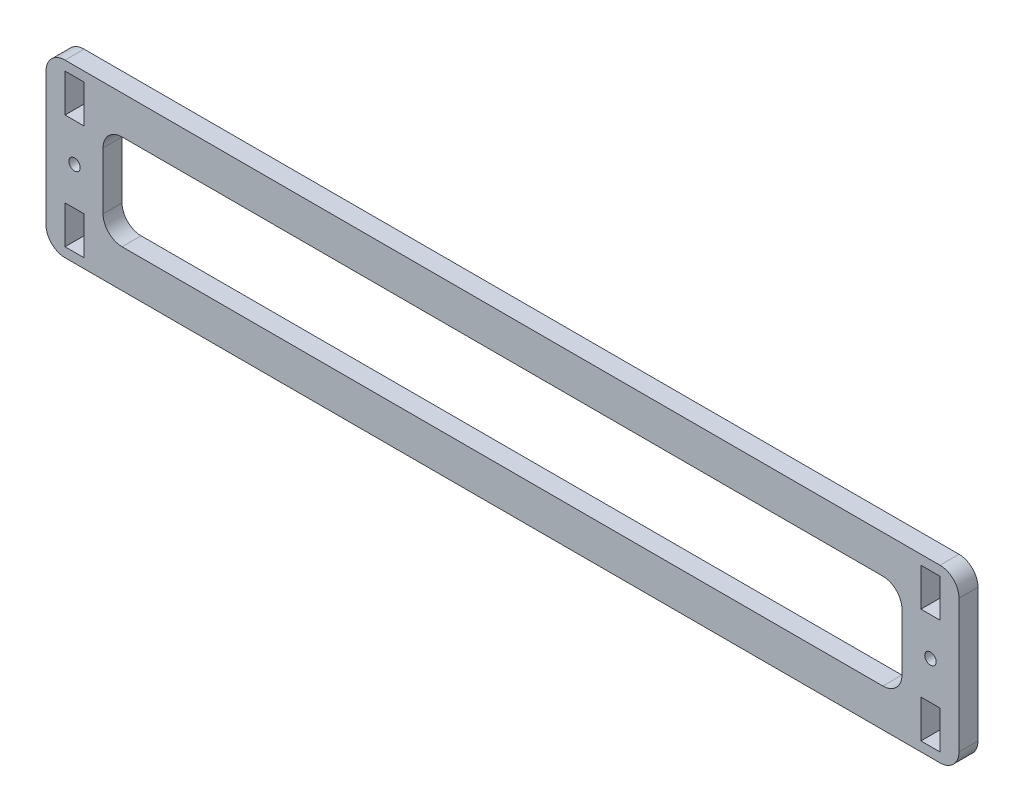
ISO-10303-21;
HEADER;
FILE_DESCRIPTION(('STEP AP214'),'2;1');
FILE_NAME('part.step','',(''),(''),'','','');
FILE_SCHEMA(('AUTOMOTIVE_DESIGN { 1 0 10303 214 1 1 1 1 }'));
ENDSEC;
DATA;
#1=APPLICATION_CONTEXT('core data for automotive mechanical design processes');
#2=APPLICATION_PROTOCOL_DEFINITION('international standard','automotive_design',2000,#1);
#3=PRODUCT_CONTEXT('',#1,'mechanical');
#4=PRODUCT('Part','Part','',(#3));
#5=PRODUCT_RELATED_PRODUCT_CATEGORY('part','',(#4));
#6=PRODUCT_DEFINITION_FORMATION('','',#4);
#7=PRODUCT_DEFINITION_CONTEXT('part definition',#1,'design');
#8=PRODUCT_DEFINITION('design','',#6,#7);
#9=PRODUCT_DEFINITION_SHAPE('','',#8);
#10=(LENGTH_UNIT() NAMED_UNIT(*) SI_UNIT(.MILLI.,.METRE.));
#11=(NAMED_UNIT(*) PLANE_ANGLE_UNIT() SI_UNIT($,.RADIAN.));
#12=(NAMED_UNIT(*) SI_UNIT($,.STERADIAN.) SOLID_ANGLE_UNIT());
#13=UNCERTAINTY_MEASURE_WITH_UNIT(LENGTH_MEASURE(1.E-05),#10,'distance_accuracy_value','');
#14=(GEOMETRIC_REPRESENTATION_CONTEXT(3) GLOBAL_UNCERTAINTY_ASSIGNED_CONTEXT((#13)) GLOBAL_UNIT_ASSIGNED_CONTEXT((#10,
#11,#12)) REPRESENTATION_CONTEXT('',''));
#15=CARTESIAN_POINT('',(0.,0.,0.));
#16=DIRECTION('',(0.,0.,1.));
#17=DIRECTION('',(1.,0.,0.));
#18=AXIS2_PLACEMENT_3D('',#15,#16,#17);
#19=CARTESIAN_POINT('',(0.,0.,5.));
#20=DIRECTION('',(0.,0.,1.));
#21=DIRECTION('',(1.,0.,0.));
#22=AXIS2_PLACEMENT_3D('',#19,#20,#21);
#23=PLANE('',#22);
#24=DIRECTION('',(0.,-1.,0.));
#25=VECTOR('',#24,1.);
#26=CARTESIAN_POINT('',(-70.8132530120482,12.5,5.));
#27=LINE('',#26,#25);
#28=CARTESIAN_POINT('',(-70.8132530120482,7.50000000000003,5.));
#29=VERTEX_POINT('',#28);
#30=CARTESIAN_POINT('',(-70.8132530120482,-7.49999999999999,5.));
#31=VERTEX_POINT('',#30);
#32=EDGE_CURVE('E524',#29,#31,#27,.T.);
#33=ORIENTED_EDGE('',*,*,#32,.F.);
#34=CARTESIAN_POINT('',(-65.8132530120482,7.50000000000003,5.));
#35=DIRECTION('',(0.,0.,1.));
#36=DIRECTION('',(1.,0.,0.));
#37=AXIS2_PLACEMENT_3D('',#34,#35,#36);
#38=CIRCLE('',#37,5.);
#39=CARTESIAN_POINT('',(-65.8132530120482,12.5,5.));
#40=VERTEX_POINT('',#39);
#41=EDGE_CURVE('E486',#29,#40,#38,.F.);
#42=ORIENTED_EDGE('',*,*,#41,.T.);
#43=DIRECTION('',(-1.,0.,0.));
#44=VECTOR('',#43,1.);
#45=CARTESIAN_POINT('',(-70.8132530120482,12.5,5.));
#46=LINE('',#45,#44);
#47=CARTESIAN_POINT('',(134.186746987952,12.5,5.));
#48=VERTEX_POINT('',#47);
#49=EDGE_CURVE('E276',#48,#40,#46,.T.);
#50=ORIENTED_EDGE('',*,*,#49,.F.);
#51=CARTESIAN_POINT('',(134.186746987952,7.50000000000003,5.));
#52=DIRECTION('',(0.,0.,1.));
#53=DIRECTION('',(1.,0.,0.));
#54=AXIS2_PLACEMENT_3D('',#51,#52,#53);
#55=CIRCLE('',#54,5.);
#56=CARTESIAN_POINT('',(139.186746987952,7.50000000000003,5.));
#57=VERTEX_POINT('',#56);
#58=EDGE_CURVE('E41',#48,#57,#55,.F.);
#59=ORIENTED_EDGE('',*,*,#58,.T.);
#60=DIRECTION('',(0.,1.,0.));
#61=VECTOR('',#60,1.);
#62=CARTESIAN_POINT('',(139.186746987952,12.5,5.));
#63=LINE('',#62,#61);
#64=CARTESIAN_POINT('',(139.186746987952,-7.49999999999999,5.));
#65=VERTEX_POINT('',#64);
#66=EDGE_CURVE('E495',#65,#57,#63,.T.);
#67=ORIENTED_EDGE('',*,*,#66,.F.);
#68=CARTESIAN_POINT('',(134.186746987952,-7.5,5.));
#69=DIRECTION('',(0.,0.,1.));
#70=DIRECTION('',(1.,0.,0.));
#71=AXIS2_PLACEMENT_3D('',#68,#69,#70);
#72=CIRCLE('',#71,5.);
#73=CARTESIAN_POINT('',(134.186746987952,-12.5,5.));
#74=VERTEX_POINT('',#73);
#75=EDGE_CURVE('E478',#65,#74,#72,.F.);
#76=ORIENTED_EDGE('',*,*,#75,.T.);
#77=DIRECTION('',(1.,0.,0.));
#78=VECTOR('',#77,1.);
#79=CARTESIAN_POINT('',(-70.8132530120482,-12.5,5.));
#80=LINE('',#79,#78);
#81=CARTESIAN_POINT('',(-65.8132530120482,-12.5,5.));
#82=VERTEX_POINT('',#81);
#83=EDGE_CURVE('E504',#82,#74,#80,.T.);
#84=ORIENTED_EDGE('',*,*,#83,.F.);
#85=CARTESIAN_POINT('',(-65.8132530120482,-7.5,5.));
#86=DIRECTION('',(0.,0.,1.));
#87=DIRECTION('',(1.,0.,0.));
#88=AXIS2_PLACEMENT_3D('',#85,#86,#87);
#89=CIRCLE('',#88,5.);
#90=EDGE_CURVE('E482',#82,#31,#89,.F.);
#91=ORIENTED_EDGE('',*,*,#90,.T.);
#92=EDGE_LOOP('',(#33,#42,#50,#59,#67,#76,#84,#91));
#93=FACE_BOUND('',#92,.T.);
#94=DIRECTION('',(0.,1.,0.));
#95=VECTOR('',#94,1.);
#96=CARTESIAN_POINT('',(149.186746987952,-20.,5.));
#97=LINE('',#96,#95);
#98=CARTESIAN_POINT('',(149.186746987952,-20.,5.));
#99=VERTEX_POINT('',#98);
#100=CARTESIAN_POINT('',(149.186746987952,-10.,5.));
#101=VERTEX_POINT('',#100);
#102=EDGE_CURVE('E295',#99,#101,#97,.T.);
#103=ORIENTED_EDGE('',*,*,#102,.F.);
#104=DIRECTION('',(1.,0.,0.));
#105=VECTOR('',#104,1.);
#106=CARTESIAN_POINT('',(149.186746987952,-20.,5.));
#107=LINE('',#106,#105);
#108=CARTESIAN_POINT('',(144.186746987952,-20.,5.));
#109=VERTEX_POINT('',#108);
#110=EDGE_CURVE('E293',#109,#99,#107,.T.);
#111=ORIENTED_EDGE('',*,*,#110,.F.);
#112=DIRECTION('',(0.,-1.,0.));
#113=VECTOR('',#112,1.);
#114=CARTESIAN_POINT('',(144.186746987952,-20.,5.));
#115=LINE('',#114,#113);
#116=CARTESIAN_POINT('',(144.186746987952,-9.99999999999997,5.));
#117=VERTEX_POINT('',#116);
#118=EDGE_CURVE('E301',#117,#109,#115,.T.);
#119=ORIENTED_EDGE('',*,*,#118,.F.);
#120=DIRECTION('',(-1.,0.,0.));
#121=VECTOR('',#120,1.);
#122=CARTESIAN_POINT('',(149.186746987952,-10.,5.));
#123=LINE('',#122,#121);
#124=EDGE_CURVE('E298',#101,#117,#123,.T.);
#125=ORIENTED_EDGE('',*,*,#124,.F.);
#126=EDGE_LOOP('',(#103,#111,#119,#125));
#127=FACE_BOUND('',#126,.T.);
#128=CARTESIAN_POINT('',(-78.3132530120482,0.,5.));
#129=DIRECTION('',(0.,0.,1.));
#130=DIRECTION('',(1.,0.,0.));
#131=AXIS2_PLACEMENT_3D('',#128,#129,#130);
#132=CIRCLE('',#131,1.5);
#133=CARTESIAN_POINT('',(-76.8132530120482,0.,5.));
#134=VERTEX_POINT('',#133);
#135=EDGE_CURVE('E324',#134,#134,#132,.T.);
#136=ORIENTED_EDGE('',*,*,#135,.F.);
#137=EDGE_LOOP('',(#136));
#138=FACE_BOUND('',#137,.T.);
#139=DIRECTION('',(0.,-1.,0.));
#140=VECTOR('',#139,1.);
#141=CARTESIAN_POINT('',(-85.8132530120482,22.5,5.));
#142=LINE('',#141,#140);
#143=CARTESIAN_POINT('',(-85.8132530120482,17.5,5.));
#144=VERTEX_POINT('',#143);
#145=CARTESIAN_POINT('',(-85.8132530120482,-17.5,5.));
#146=VERTEX_POINT('',#145);
#147=EDGE_CURVE('E392',#144,#146,#142,.T.);
#148=ORIENTED_EDGE('',*,*,#147,.T.);
#149=CARTESIAN_POINT('',(-80.8132530120482,-17.5,5.));
#150=DIRECTION('',(0.,0.,1.));
#151=DIRECTION('',(1.,0.,0.));
#152=AXIS2_PLACEMENT_3D('',#149,#150,#151);
#153=CIRCLE('',#152,5.);
#154=CARTESIAN_POINT('',(-80.8132530120482,-22.5,5.));
#155=VERTEX_POINT('',#154);
#156=EDGE_CURVE('E447',#146,#155,#153,.T.);
#157=ORIENTED_EDGE('',*,*,#156,.T.);
#158=DIRECTION('',(1.,0.,0.));
#159=VECTOR('',#158,1.);
#160=CARTESIAN_POINT('',(-85.8132530120482,-22.5,5.));
#161=LINE('',#160,#159);
#162=CARTESIAN_POINT('',(149.186746987952,-22.5,5.));
#163=VERTEX_POINT('',#162);
#164=EDGE_CURVE('E395',#155,#163,#161,.T.);
#165=ORIENTED_EDGE('',*,*,#164,.T.);
#166=CARTESIAN_POINT('',(149.186746987952,-17.5,5.));
#167=DIRECTION('',(0.,0.,1.));
#168=DIRECTION('',(1.,0.,0.));
#169=AXIS2_PLACEMENT_3D('',#166,#167,#168);
#170=CIRCLE('',#169,5.);
#171=CARTESIAN_POINT('',(154.186746987952,-17.5,5.));
#172=VERTEX_POINT('',#171);
#173=EDGE_CURVE('E444',#163,#172,#170,.T.);
#174=ORIENTED_EDGE('',*,*,#173,.T.);
#175=DIRECTION('',(0.,1.,0.));
#176=VECTOR('',#175,1.);
#177=CARTESIAN_POINT('',(154.186746987952,22.5,5.));
#178=LINE('',#177,#176);
#179=CARTESIAN_POINT('',(154.186746987952,17.5,5.));
#180=VERTEX_POINT('',#179);
#181=EDGE_CURVE('E399',#172,#180,#178,.T.);
#182=ORIENTED_EDGE('',*,*,#181,.T.);
#183=CARTESIAN_POINT('',(149.186746987952,17.5,5.));
#184=DIRECTION('',(0.,0.,1.));
#185=DIRECTION('',(1.,0.,0.));
#186=AXIS2_PLACEMENT_3D('',#183,#184,#185);
#187=CIRCLE('',#186,5.);
#188=CARTESIAN_POINT('',(149.186746987952,22.5,5.));
#189=VERTEX_POINT('',#188);
#190=EDGE_CURVE('E55',#180,#189,#187,.T.);
#191=ORIENTED_EDGE('',*,*,#190,.T.);
#192=DIRECTION('',(-1.,0.,0.));
#193=VECTOR('',#192,1.);
#194=CARTESIAN_POINT('',(-85.8132530120482,22.5,5.));
#195=LINE('',#194,#193);
#196=CARTESIAN_POINT('',(-80.8132530120482,22.5,5.));
#197=VERTEX_POINT('',#196);
#198=EDGE_CURVE('E401',#189,#197,#195,.T.);
#199=ORIENTED_EDGE('',*,*,#198,.T.);
#200=CARTESIAN_POINT('',(-80.8132530120482,17.5,5.));
#201=DIRECTION('',(0.,0.,1.));
#202=DIRECTION('',(1.,0.,0.));
#203=AXIS2_PLACEMENT_3D('',#200,#201,#202);
#204=CIRCLE('',#203,5.);
#205=EDGE_CURVE('E442',#197,#144,#204,.T.);
#206=ORIENTED_EDGE('',*,*,#205,.T.);
#207=EDGE_LOOP('',(#148,#157,#165,#174,#182,#191,#199,#206));
#208=FACE_BOUND('',#207,.T.);
#209=DIRECTION('',(1.,0.,0.));
#210=VECTOR('',#209,1.);
#211=CARTESIAN_POINT('',(-80.8132530120482,10.,5.));
#212=LINE('',#211,#210);
#213=CARTESIAN_POINT('',(-80.8132530120482,10.,5.));
#214=VERTEX_POINT('',#213);
#215=CARTESIAN_POINT('',(-75.8132530120482,10.,5.));
#216=VERTEX_POINT('',#215);
#217=EDGE_CURVE('E363',#214,#216,#212,.T.);
#218=ORIENTED_EDGE('',*,*,#217,.F.);
#219=DIRECTION('',(0.,-1.,0.));
#220=VECTOR('',#219,1.);
#221=CARTESIAN_POINT('',(-80.8132530120482,20.,5.));
#222=LINE('',#221,#220);
#223=CARTESIAN_POINT('',(-80.8132530120482,20.,5.));
#224=VERTEX_POINT('',#223);
#225=EDGE_CURVE('E361',#224,#214,#222,.T.);
#226=ORIENTED_EDGE('',*,*,#225,.F.);
#227=DIRECTION('',(-1.,0.,0.));
#228=VECTOR('',#227,1.);
#229=CARTESIAN_POINT('',(-80.8132530120482,20.,5.));
#230=LINE('',#229,#228);
#231=CARTESIAN_POINT('',(-75.8132530120482,20.,5.));
#232=VERTEX_POINT('',#231);
#233=EDGE_CURVE('E369',#232,#224,#230,.T.);
#234=ORIENTED_EDGE('',*,*,#233,.F.);
#235=DIRECTION('',(0.,1.,0.));
#236=VECTOR('',#235,1.);
#237=CARTESIAN_POINT('',(-75.8132530120482,20.,5.));
#238=LINE('',#237,#236);
#239=EDGE_CURVE('E366',#216,#232,#238,.T.);
#240=ORIENTED_EDGE('',*,*,#239,.F.);
#241=EDGE_LOOP('',(#218,#226,#234,#240));
#242=FACE_BOUND('',#241,.T.);
#243=DIRECTION('',(1.,0.,0.));
#244=VECTOR('',#243,1.);
#245=CARTESIAN_POINT('',(-80.8132530120482,-20.,5.));
#246=LINE('',#245,#244);
#247=CARTESIAN_POINT('',(-80.8132530120482,-20.,5.));
#248=VERTEX_POINT('',#247);
#249=CARTESIAN_POINT('',(-75.8132530120482,-20.,5.));
#250=VERTEX_POINT('',#249);
#251=EDGE_CURVE('E332',#248,#250,#246,.T.);
#252=ORIENTED_EDGE('',*,*,#251,.F.);
#253=DIRECTION('',(0.,-1.,0.));
#254=VECTOR('',#253,1.);
#255=CARTESIAN_POINT('',(-80.8132530120482,-20.,5.));
#256=LINE('',#255,#254);
#257=CARTESIAN_POINT('',(-80.8132530120482,-10.,5.));
#258=VERTEX_POINT('',#257);
#259=EDGE_CURVE('E330',#258,#248,#256,.T.);
#260=ORIENTED_EDGE('',*,*,#259,.F.);
#261=DIRECTION('',(-1.,0.,0.));
#262=VECTOR('',#261,1.);
#263=CARTESIAN_POINT('',(-80.8132530120482,-10.,5.));
#264=LINE('',#263,#262);
#265=CARTESIAN_POINT('',(-75.8132530120482,-10.,5.));
#266=VERTEX_POINT('',#265);
#267=EDGE_CURVE('E338',#266,#258,#264,.T.);
#268=ORIENTED_EDGE('',*,*,#267,.F.);
#269=DIRECTION('',(0.,1.,0.));
#270=VECTOR('',#269,1.);
#271=CARTESIAN_POINT('',(-75.8132530120482,-20.,5.));
#272=LINE('',#271,#270);
#273=EDGE_CURVE('E335',#250,#266,#272,.T.);
#274=ORIENTED_EDGE('',*,*,#273,.F.);
#275=EDGE_LOOP('',(#252,#260,#268,#274));
#276=FACE_BOUND('',#275,.T.);
#277=CARTESIAN_POINT('',(146.686746987952,0.,5.));
#278=DIRECTION('',(0.,0.,1.));
#279=DIRECTION('',(-1.,0.,0.));
#280=AXIS2_PLACEMENT_3D('',#277,#278,#279);
#281=CIRCLE('',#280,1.50000000000008);
#282=CARTESIAN_POINT('',(145.186746987952,0.,5.));
#283=VERTEX_POINT('',#282);
#284=EDGE_CURVE('E287',#283,#283,#281,.T.);
#285=ORIENTED_EDGE('',*,*,#284,.F.);
#286=EDGE_LOOP('',(#285));
#287=FACE_BOUND('',#286,.T.);
#288=DIRECTION('',(-1.,0.,0.));
#289=VECTOR('',#288,1.);
#290=CARTESIAN_POINT('',(149.186746987952,20.,5.));
#291=LINE('',#290,#289);
#292=CARTESIAN_POINT('',(149.186746987952,20.,5.));
#293=VERTEX_POINT('',#292);
#294=CARTESIAN_POINT('',(144.186746987952,20.,5.));
#295=VERTEX_POINT('',#294);
#296=EDGE_CURVE('E254',#293,#295,#291,.T.);
#297=ORIENTED_EDGE('',*,*,#296,.F.);
#298=DIRECTION('',(0.,1.,0.));
#299=VECTOR('',#298,1.);
#300=CARTESIAN_POINT('',(149.186746987952,20.,5.));
#301=LINE('',#300,#299);
#302=CARTESIAN_POINT('',(149.186746987952,10.,5.));
#303=VERTEX_POINT('',#302);
#304=EDGE_CURVE('E244',#303,#293,#301,.T.);
#305=ORIENTED_EDGE('',*,*,#304,.F.);
#306=DIRECTION('',(1.,0.,0.));
#307=VECTOR('',#306,1.);
#308=CARTESIAN_POINT('',(149.186746987952,10.,5.));
#309=LINE('',#308,#307);
#310=CARTESIAN_POINT('',(144.186746987952,9.99999999999997,5.));
#311=VERTEX_POINT('',#310);
#312=EDGE_CURVE('E269',#311,#303,#309,.T.);
#313=ORIENTED_EDGE('',*,*,#312,.F.);
#314=DIRECTION('',(0.,-1.,0.));
#315=VECTOR('',#314,1.);
#316=CARTESIAN_POINT('',(144.186746987952,20.,5.));
#317=LINE('',#316,#315);
#318=EDGE_CURVE('E267',#295,#311,#317,.T.);
#319=ORIENTED_EDGE('',*,*,#318,.F.);
#320=EDGE_LOOP('',(#297,#305,#313,#319));
#321=FACE_BOUND('',#320,.T.);
#322=ADVANCED_FACE('F33',(#93,#127,#138,#208,#242,#276,#287,#321),#23,.T.);
#323=CARTESIAN_POINT('',(0.,0.,0.));
#324=DIRECTION('',(0.,0.,1.));
#325=DIRECTION('',(1.,0.,0.));
#326=AXIS2_PLACEMENT_3D('',#323,#324,#325);
#327=PLANE('',#326);
#328=DIRECTION('',(0.,1.,0.));
#329=VECTOR('',#328,1.);
#330=CARTESIAN_POINT('',(139.186746987952,0.,0.));
#331=LINE('',#330,#329);
#332=CARTESIAN_POINT('',(139.186746987952,-7.5,0.));
#333=VERTEX_POINT('',#332);
#334=CARTESIAN_POINT('',(139.186746987952,7.50000000000003,0.));
#335=VERTEX_POINT('',#334);
#336=EDGE_CURVE('E415',#333,#335,#331,.T.);
#337=ORIENTED_EDGE('',*,*,#336,.T.);
#338=CARTESIAN_POINT('',(134.186746987952,7.50000000000003,0.));
#339=DIRECTION('',(0.,0.,1.));
#340=DIRECTION('',(1.,0.,0.));
#341=AXIS2_PLACEMENT_3D('',#338,#339,#340);
#342=CIRCLE('',#341,5.);
#343=CARTESIAN_POINT('',(134.186746987952,12.5,0.));
#344=VERTEX_POINT('',#343);
#345=EDGE_CURVE('E11',#335,#344,#342,.T.);
#346=ORIENTED_EDGE('',*,*,#345,.T.);
#347=DIRECTION('',(-1.,0.,0.));
#348=VECTOR('',#347,1.);
#349=CARTESIAN_POINT('',(0.,12.5,0.));
#350=LINE('',#349,#348);
#351=CARTESIAN_POINT('',(-65.8132530120482,12.5,0.));
#352=VERTEX_POINT('',#351);
#353=EDGE_CURVE('E418',#344,#352,#350,.T.);
#354=ORIENTED_EDGE('',*,*,#353,.T.);
#355=CARTESIAN_POINT('',(-65.8132530120482,7.50000000000003,0.));
#356=DIRECTION('',(0.,0.,1.));
#357=DIRECTION('',(1.,0.,0.));
#358=AXIS2_PLACEMENT_3D('',#355,#356,#357);
#359=CIRCLE('',#358,5.);
#360=CARTESIAN_POINT('',(-70.8132530120482,7.50000000000003,0.));
#361=VERTEX_POINT('',#360);
#362=EDGE_CURVE('E488',#352,#361,#359,.T.);
#363=ORIENTED_EDGE('',*,*,#362,.T.);
#364=DIRECTION('',(0.,-1.,0.));
#365=VECTOR('',#364,1.);
#366=CARTESIAN_POINT('',(-70.8132530120482,0.,0.));
#367=LINE('',#366,#365);
#368=CARTESIAN_POINT('',(-70.8132530120482,-7.5,0.));
#369=VERTEX_POINT('',#368);
#370=EDGE_CURVE('E421',#361,#369,#367,.T.);
#371=ORIENTED_EDGE('',*,*,#370,.T.);
#372=CARTESIAN_POINT('',(-65.8132530120482,-7.5,0.));
#373=DIRECTION('',(0.,0.,1.));
#374=DIRECTION('',(1.,0.,0.));
#375=AXIS2_PLACEMENT_3D('',#372,#373,#374);
#376=CIRCLE('',#375,5.);
#377=CARTESIAN_POINT('',(-65.8132530120482,-12.5,0.));
#378=VERTEX_POINT('',#377);
#379=EDGE_CURVE('E484',#369,#378,#376,.T.);
#380=ORIENTED_EDGE('',*,*,#379,.T.);
#381=DIRECTION('',(1.,0.,0.));
#382=VECTOR('',#381,1.);
#383=CARTESIAN_POINT('',(0.,-12.5,0.));
#384=LINE('',#383,#382);
#385=CARTESIAN_POINT('',(134.186746987952,-12.5,0.));
#386=VERTEX_POINT('',#385);
#387=EDGE_CURVE('E403',#378,#386,#384,.T.);
#388=ORIENTED_EDGE('',*,*,#387,.T.);
#389=CARTESIAN_POINT('',(134.186746987952,-7.5,0.));
#390=DIRECTION('',(0.,0.,1.));
#391=DIRECTION('',(1.,0.,0.));
#392=AXIS2_PLACEMENT_3D('',#389,#390,#391);
#393=CIRCLE('',#392,5.);
#394=EDGE_CURVE('E480',#386,#333,#393,.T.);
#395=ORIENTED_EDGE('',*,*,#394,.T.);
#396=EDGE_LOOP('',(#337,#346,#354,#363,#371,#380,#388,#395));
#397=FACE_BOUND('',#396,.T.);
#398=CARTESIAN_POINT('',(146.686746987952,0.,0.));
#399=DIRECTION('',(0.,0.,1.));
#400=DIRECTION('',(-1.,0.,0.));
#401=AXIS2_PLACEMENT_3D('',#398,#399,#400);
#402=CIRCLE('',#401,1.50000000000008);
#403=CARTESIAN_POINT('',(145.186746987952,0.,0.));
#404=VERTEX_POINT('',#403);
#405=EDGE_CURVE('E262',#404,#404,#402,.T.);
#406=ORIENTED_EDGE('',*,*,#405,.T.);
#407=EDGE_LOOP('',(#406));
#408=FACE_BOUND('',#407,.T.);
#409=DIRECTION('',(1.,0.,0.));
#410=VECTOR('',#409,1.);
#411=CARTESIAN_POINT('',(149.186746987952,-20.,0.));
#412=LINE('',#411,#410);
#413=CARTESIAN_POINT('',(144.186746987952,-20.,0.));
#414=VERTEX_POINT('',#413);
#415=CARTESIAN_POINT('',(149.186746987952,-20.,0.));
#416=VERTEX_POINT('',#415);
#417=EDGE_CURVE('E290',#414,#416,#412,.T.);
#418=ORIENTED_EDGE('',*,*,#417,.T.);
#419=DIRECTION('',(0.,1.,0.));
#420=VECTOR('',#419,1.);
#421=CARTESIAN_POINT('',(149.186746987952,-20.,0.));
#422=LINE('',#421,#420);
#423=CARTESIAN_POINT('',(149.186746987952,-10.,0.));
#424=VERTEX_POINT('',#423);
#425=EDGE_CURVE('E306',#416,#424,#422,.T.);
#426=ORIENTED_EDGE('',*,*,#425,.T.);
#427=DIRECTION('',(-1.,0.,0.));
#428=VECTOR('',#427,1.);
#429=CARTESIAN_POINT('',(149.186746987952,-10.,0.));
#430=LINE('',#429,#428);
#431=CARTESIAN_POINT('',(144.186746987952,-9.99999999999997,0.));
#432=VERTEX_POINT('',#431);
#433=EDGE_CURVE('E309',#424,#432,#430,.T.);
#434=ORIENTED_EDGE('',*,*,#433,.T.);
#435=DIRECTION('',(0.,-1.,0.));
#436=VECTOR('',#435,1.);
#437=CARTESIAN_POINT('',(144.186746987952,-20.,0.));
#438=LINE('',#437,#436);
#439=EDGE_CURVE('E296',#432,#414,#438,.T.);
#440=ORIENTED_EDGE('',*,*,#439,.T.);
#441=EDGE_LOOP('',(#418,#426,#434,#440));
#442=FACE_BOUND('',#441,.T.);
#443=DIRECTION('',(0.,-1.,0.));
#444=VECTOR('',#443,1.);
#445=CARTESIAN_POINT('',(-80.8132530120482,20.,0.));
#446=LINE('',#445,#444);
#447=CARTESIAN_POINT('',(-80.8132530120482,20.,0.));
#448=VERTEX_POINT('',#447);
#449=CARTESIAN_POINT('',(-80.8132530120482,10.,0.));
#450=VERTEX_POINT('',#449);
#451=EDGE_CURVE('E360',#448,#450,#446,.T.);
#452=ORIENTED_EDGE('',*,*,#451,.T.);
#453=DIRECTION('',(1.,0.,0.));
#454=VECTOR('',#453,1.);
#455=CARTESIAN_POINT('',(-80.8132530120482,10.,0.));
#456=LINE('',#455,#454);
#457=CARTESIAN_POINT('',(-75.8132530120482,10.,0.));
#458=VERTEX_POINT('',#457);
#459=EDGE_CURVE('E374',#450,#458,#456,.T.);
#460=ORIENTED_EDGE('',*,*,#459,.T.);
#461=DIRECTION('',(0.,1.,0.));
#462=VECTOR('',#461,1.);
#463=CARTESIAN_POINT('',(-75.8132530120482,20.,0.));
#464=LINE('',#463,#462);
#465=CARTESIAN_POINT('',(-75.8132530120482,20.,0.));
#466=VERTEX_POINT('',#465);
#467=EDGE_CURVE('E377',#458,#466,#464,.T.);
#468=ORIENTED_EDGE('',*,*,#467,.T.);
#469=DIRECTION('',(-1.,0.,0.));
#470=VECTOR('',#469,1.);
#471=CARTESIAN_POINT('',(-80.8132530120482,20.,0.));
#472=LINE('',#471,#470);
#473=EDGE_CURVE('E364',#466,#448,#472,.T.);
#474=ORIENTED_EDGE('',*,*,#473,.T.);
#475=EDGE_LOOP('',(#452,#460,#468,#474));
#476=FACE_BOUND('',#475,.T.);
#477=DIRECTION('',(1.,0.,0.));
#478=VECTOR('',#477,1.);
#479=CARTESIAN_POINT('',(-85.8132530120482,-22.5,0.));
#480=LINE('',#479,#478);
#481=CARTESIAN_POINT('',(-80.8132530120482,-22.5,0.));
#482=VERTEX_POINT('',#481);
#483=CARTESIAN_POINT('',(149.186746987952,-22.5,0.));
#484=VERTEX_POINT('',#483);
#485=EDGE_CURVE('E406',#482,#484,#480,.T.);
#486=ORIENTED_EDGE('',*,*,#485,.F.);
#487=CARTESIAN_POINT('',(-80.8132530120482,-17.5,0.));
#488=DIRECTION('',(0.,0.,1.));
#489=DIRECTION('',(1.,0.,0.));
#490=AXIS2_PLACEMENT_3D('',#487,#488,#489);
#491=CIRCLE('',#490,5.);
#492=CARTESIAN_POINT('',(-85.8132530120482,-17.5,0.));
#493=VERTEX_POINT('',#492);
#494=EDGE_CURVE('E435',#482,#493,#491,.F.);
#495=ORIENTED_EDGE('',*,*,#494,.T.);
#496=DIRECTION('',(0.,-1.,0.));
#497=VECTOR('',#496,1.);
#498=CARTESIAN_POINT('',(-85.8132530120482,22.5,0.));
#499=LINE('',#498,#497);
#500=CARTESIAN_POINT('',(-85.8132530120482,17.5,0.));
#501=VERTEX_POINT('',#500);
#502=EDGE_CURVE('E391',#501,#493,#499,.T.);
#503=ORIENTED_EDGE('',*,*,#502,.F.);
#504=CARTESIAN_POINT('',(-80.8132530120482,17.5,0.));
#505=DIRECTION('',(0.,0.,1.));
#506=DIRECTION('',(1.,0.,0.));
#507=AXIS2_PLACEMENT_3D('',#504,#505,#506);
#508=CIRCLE('',#507,5.);
#509=CARTESIAN_POINT('',(-80.8132530120482,22.5,0.));
#510=VERTEX_POINT('',#509);
#511=EDGE_CURVE('E429',#501,#510,#508,.F.);
#512=ORIENTED_EDGE('',*,*,#511,.T.);
#513=DIRECTION('',(-1.,0.,0.));
#514=VECTOR('',#513,1.);
#515=CARTESIAN_POINT('',(-85.8132530120482,22.5,0.));
#516=LINE('',#515,#514);
#517=CARTESIAN_POINT('',(149.186746987952,22.5,0.));
#518=VERTEX_POINT('',#517);
#519=EDGE_CURVE('E396',#518,#510,#516,.T.);
#520=ORIENTED_EDGE('',*,*,#519,.F.);
#521=CARTESIAN_POINT('',(149.186746987952,17.5,0.));
#522=DIRECTION('',(0.,0.,1.));
#523=DIRECTION('',(1.,0.,0.));
#524=AXIS2_PLACEMENT_3D('',#521,#522,#523);
#525=CIRCLE('',#524,5.);
#526=CARTESIAN_POINT('',(154.186746987952,17.5,0.));
#527=VERTEX_POINT('',#526);
#528=EDGE_CURVE('E433',#518,#527,#525,.F.);
#529=ORIENTED_EDGE('',*,*,#528,.T.);
#530=DIRECTION('',(0.,1.,0.));
#531=VECTOR('',#530,1.);
#532=CARTESIAN_POINT('',(154.186746987952,22.5,0.));
#533=LINE('',#532,#531);
#534=CARTESIAN_POINT('',(154.186746987952,-17.5,0.));
#535=VERTEX_POINT('',#534);
#536=EDGE_CURVE('E409',#535,#527,#533,.T.);
#537=ORIENTED_EDGE('',*,*,#536,.F.);
#538=CARTESIAN_POINT('',(149.186746987952,-17.5,0.));
#539=DIRECTION('',(0.,0.,1.));
#540=DIRECTION('',(1.,0.,0.));
#541=AXIS2_PLACEMENT_3D('',#538,#539,#540);
#542=CIRCLE('',#541,5.);
#543=EDGE_CURVE('E431',#535,#484,#542,.F.);
#544=ORIENTED_EDGE('',*,*,#543,.T.);
#545=EDGE_LOOP('',(#486,#495,#503,#512,#520,#529,#537,#544));
#546=FACE_BOUND('',#545,.T.);
#547=DIRECTION('',(0.,-1.,0.));
#548=VECTOR('',#547,1.);
#549=CARTESIAN_POINT('',(-80.8132530120482,-20.,0.));
#550=LINE('',#549,#548);
#551=CARTESIAN_POINT('',(-80.8132530120482,-10.,0.));
#552=VERTEX_POINT('',#551);
#553=CARTESIAN_POINT('',(-80.8132530120482,-20.,0.));
#554=VERTEX_POINT('',#553);
#555=EDGE_CURVE('E327',#552,#554,#550,.T.);
#556=ORIENTED_EDGE('',*,*,#555,.T.);
#557=DIRECTION('',(1.,0.,0.));
#558=VECTOR('',#557,1.);
#559=CARTESIAN_POINT('',(-80.8132530120482,-20.,0.));
#560=LINE('',#559,#558);
#561=CARTESIAN_POINT('',(-75.8132530120482,-20.,0.));
#562=VERTEX_POINT('',#561);
#563=EDGE_CURVE('E343',#554,#562,#560,.T.);
#564=ORIENTED_EDGE('',*,*,#563,.T.);
#565=DIRECTION('',(0.,1.,0.));
#566=VECTOR('',#565,1.);
#567=CARTESIAN_POINT('',(-75.8132530120482,-20.,0.));
#568=LINE('',#567,#566);
#569=CARTESIAN_POINT('',(-75.8132530120482,-10.,0.));
#570=VERTEX_POINT('',#569);
#571=EDGE_CURVE('E346',#562,#570,#568,.T.);
#572=ORIENTED_EDGE('',*,*,#571,.T.);
#573=DIRECTION('',(-1.,0.,0.));
#574=VECTOR('',#573,1.);
#575=CARTESIAN_POINT('',(-80.8132530120482,-10.,0.));
#576=LINE('',#575,#574);
#577=EDGE_CURVE('E333',#570,#552,#576,.T.);
#578=ORIENTED_EDGE('',*,*,#577,.T.);
#579=EDGE_LOOP('',(#556,#564,#572,#578));
#580=FACE_BOUND('',#579,.T.);
#581=CARTESIAN_POINT('',(-78.3132530120482,0.,0.));
#582=DIRECTION('',(0.,0.,1.));
#583=DIRECTION('',(1.,0.,0.));
#584=AXIS2_PLACEMENT_3D('',#581,#582,#583);
#585=CIRCLE('',#584,1.5);
#586=CARTESIAN_POINT('',(-76.8132530120482,0.,0.));
#587=VERTEX_POINT('',#586);
#588=EDGE_CURVE('E323',#587,#587,#585,.T.);
#589=ORIENTED_EDGE('',*,*,#588,.T.);
#590=EDGE_LOOP('',(#589));
#591=FACE_BOUND('',#590,.T.);
#592=DIRECTION('',(0.,1.,0.));
#593=VECTOR('',#592,1.);
#594=CARTESIAN_POINT('',(149.186746987952,20.,0.));
#595=LINE('',#594,#593);
#596=CARTESIAN_POINT('',(149.186746987952,10.,0.));
#597=VERTEX_POINT('',#596);
#598=CARTESIAN_POINT('',(149.186746987952,20.,0.));
#599=VERTEX_POINT('',#598);
#600=EDGE_CURVE('E274',#597,#599,#595,.T.);
#601=ORIENTED_EDGE('',*,*,#600,.T.);
#602=DIRECTION('',(-1.,0.,0.));
#603=VECTOR('',#602,1.);
#604=CARTESIAN_POINT('',(149.186746987952,20.,0.));
#605=LINE('',#604,#603);
#606=CARTESIAN_POINT('',(144.186746987952,20.,0.));
#607=VERTEX_POINT('',#606);
#608=EDGE_CURVE('E261',#599,#607,#605,.T.);
#609=ORIENTED_EDGE('',*,*,#608,.T.);
#610=DIRECTION('',(0.,-1.,0.));
#611=VECTOR('',#610,1.);
#612=CARTESIAN_POINT('',(144.186746987952,20.,0.));
#613=LINE('',#612,#611);
#614=CARTESIAN_POINT('',(144.186746987952,9.99999999999997,0.));
#615=VERTEX_POINT('',#614);
#616=EDGE_CURVE('E278',#607,#615,#613,.T.);
#617=ORIENTED_EDGE('',*,*,#616,.T.);
#618=DIRECTION('',(1.,0.,0.));
#619=VECTOR('',#618,1.);
#620=CARTESIAN_POINT('',(149.186746987952,10.,0.));
#621=LINE('',#620,#619);
#622=EDGE_CURVE('E255',#615,#597,#621,.T.);
#623=ORIENTED_EDGE('',*,*,#622,.T.);
#624=EDGE_LOOP('',(#601,#609,#617,#623));
#625=FACE_BOUND('',#624,.T.);
#626=ADVANCED_FACE('F509',(#397,#408,#442,#476,#546,#580,#591,#625),#327,.F.);
#627=CARTESIAN_POINT('',(-85.8132530120482,22.5,5.));
#628=DIRECTION('',(1.,0.,0.));
#629=DIRECTION('',(0.,0.,-1.));
#630=AXIS2_PLACEMENT_3D('',#627,#628,#629);
#631=PLANE('',#630);
#632=ORIENTED_EDGE('',*,*,#502,.T.);
#633=DIRECTION('',(0.,0.,-1.));
#634=VECTOR('',#633,1.);
#635=CARTESIAN_POINT('',(-85.8132530120482,-17.5,5.));
#636=LINE('',#635,#634);
#637=EDGE_CURVE('E440',#493,#146,#636,.F.);
#638=ORIENTED_EDGE('',*,*,#637,.T.);
#639=ORIENTED_EDGE('',*,*,#147,.F.);
#640=DIRECTION('',(0.,0.,-1.));
#641=VECTOR('',#640,1.);
#642=CARTESIAN_POINT('',(-85.8132530120482,17.5,5.));
#643=LINE('',#642,#641);
#644=EDGE_CURVE('E437',#144,#501,#643,.T.);
#645=ORIENTED_EDGE('',*,*,#644,.T.);
#646=EDGE_LOOP('',(#632,#638,#639,#645));
#647=FACE_BOUND('',#646,.T.);
#648=ADVANCED_FACE('F555',(#647),#631,.F.);
#649=CARTESIAN_POINT('',(-85.8132530120482,-22.5,5.));
#650=DIRECTION('',(0.,1.,0.));
#651=DIRECTION('',(-1.,0.,0.));
#652=AXIS2_PLACEMENT_3D('',#649,#650,#651);
#653=PLANE('',#652);
#654=ORIENTED_EDGE('',*,*,#164,.F.);
#655=DIRECTION('',(0.,0.,-1.));
#656=VECTOR('',#655,1.);
#657=CARTESIAN_POINT('',(-80.8132530120482,-22.5,5.));
#658=LINE('',#657,#656);
#659=EDGE_CURVE('E426',#155,#482,#658,.T.);
#660=ORIENTED_EDGE('',*,*,#659,.T.);
#661=ORIENTED_EDGE('',*,*,#485,.T.);
#662=DIRECTION('',(0.,0.,-1.));
#663=VECTOR('',#662,1.);
#664=CARTESIAN_POINT('',(149.186746987952,-22.5,5.));
#665=LINE('',#664,#663);
#666=EDGE_CURVE('E424',#484,#163,#665,.F.);
#667=ORIENTED_EDGE('',*,*,#666,.T.);
#668=EDGE_LOOP('',(#654,#660,#661,#667));
#669=FACE_BOUND('',#668,.T.);
#670=ADVANCED_FACE('F567',(#669),#653,.F.);
#671=CARTESIAN_POINT('',(154.186746987952,22.5,5.));
#672=DIRECTION('',(-1.,0.,0.));
#673=DIRECTION('',(0.,0.,1.));
#674=AXIS2_PLACEMENT_3D('',#671,#672,#673);
#675=PLANE('',#674);
#676=ORIENTED_EDGE('',*,*,#536,.T.);
#677=DIRECTION('',(0.,0.,-1.));
#678=VECTOR('',#677,1.);
#679=CARTESIAN_POINT('',(154.186746987952,17.5,5.));
#680=LINE('',#679,#678);
#681=EDGE_CURVE('E456',#527,#180,#680,.F.);
#682=ORIENTED_EDGE('',*,*,#681,.T.);
#683=ORIENTED_EDGE('',*,*,#181,.F.);
#684=DIRECTION('',(0.,0.,-1.));
#685=VECTOR('',#684,1.);
#686=CARTESIAN_POINT('',(154.186746987952,-17.5,5.));
#687=LINE('',#686,#685);
#688=EDGE_CURVE('E453',#172,#535,#687,.T.);
#689=ORIENTED_EDGE('',*,*,#688,.T.);
#690=EDGE_LOOP('',(#676,#682,#683,#689));
#691=FACE_BOUND('',#690,.T.);
#692=ADVANCED_FACE('F564',(#691),#675,.F.);
#693=CARTESIAN_POINT('',(-85.8132530120482,22.5,5.));
#694=DIRECTION('',(0.,-1.,0.));
#695=DIRECTION('',(1.,0.,0.));
#696=AXIS2_PLACEMENT_3D('',#693,#694,#695);
#697=PLANE('',#696);
#698=ORIENTED_EDGE('',*,*,#198,.F.);
#699=DIRECTION('',(0.,0.,-1.));
#700=VECTOR('',#699,1.);
#701=CARTESIAN_POINT('',(149.186746987952,22.5,5.));
#702=LINE('',#701,#700);
#703=EDGE_CURVE('E450',#189,#518,#702,.T.);
#704=ORIENTED_EDGE('',*,*,#703,.T.);
#705=ORIENTED_EDGE('',*,*,#519,.T.);
#706=DIRECTION('',(0.,0.,-1.));
#707=VECTOR('',#706,1.);
#708=CARTESIAN_POINT('',(-80.8132530120482,22.5,5.));
#709=LINE('',#708,#707);
#710=EDGE_CURVE('E48',#510,#197,#709,.F.);
#711=ORIENTED_EDGE('',*,*,#710,.T.);
#712=EDGE_LOOP('',(#698,#704,#705,#711));
#713=FACE_BOUND('',#712,.T.);
#714=ADVANCED_FACE('F561',(#713),#697,.F.);
#715=CARTESIAN_POINT('',(-80.8132530120482,20.,5.));
#716=DIRECTION('',(1.,0.,0.));
#717=DIRECTION('',(0.,0.,-1.));
#718=AXIS2_PLACEMENT_3D('',#715,#716,#717);
#719=PLANE('',#718);
#720=ORIENTED_EDGE('',*,*,#451,.F.);
#721=DIRECTION('',(0.,0.,-1.));
#722=VECTOR('',#721,1.);
#723=CARTESIAN_POINT('',(-80.8132530120482,20.,5.));
#724=LINE('',#723,#722);
#725=EDGE_CURVE('E371',#224,#448,#724,.T.);
#726=ORIENTED_EDGE('',*,*,#725,.F.);
#727=ORIENTED_EDGE('',*,*,#225,.T.);
#728=DIRECTION('',(0.,0.,-1.));
#729=VECTOR('',#728,1.);
#730=CARTESIAN_POINT('',(-80.8132530120482,10.,5.));
#731=LINE('',#730,#729);
#732=EDGE_CURVE('E388',#214,#450,#731,.T.);
#733=ORIENTED_EDGE('',*,*,#732,.T.);
#734=EDGE_LOOP('',(#720,#726,#727,#733));
#735=FACE_BOUND('',#734,.T.);
#736=ADVANCED_FACE('F558',(#735),#719,.T.);
#737=CARTESIAN_POINT('',(-80.8132530120482,10.,5.));
#738=DIRECTION('',(0.,1.,0.));
#739=DIRECTION('',(0.,0.,1.));
#740=AXIS2_PLACEMENT_3D('',#737,#738,#739);
#741=PLANE('',#740);
#742=ORIENTED_EDGE('',*,*,#459,.F.);
#743=ORIENTED_EDGE('',*,*,#732,.F.);
#744=ORIENTED_EDGE('',*,*,#217,.T.);
#745=DIRECTION('',(0.,0.,-1.));
#746=VECTOR('',#745,1.);
#747=CARTESIAN_POINT('',(-75.8132530120482,10.,5.));
#748=LINE('',#747,#746);
#749=EDGE_CURVE('E386',#216,#458,#748,.T.);
#750=ORIENTED_EDGE('',*,*,#749,.T.);
#751=EDGE_LOOP('',(#742,#743,#744,#750));
#752=FACE_BOUND('',#751,.T.);
#753=ADVANCED_FACE('F674',(#752),#741,.T.);
#754=CARTESIAN_POINT('',(-75.8132530120482,20.,5.));
#755=DIRECTION('',(-1.,0.,0.));
#756=DIRECTION('',(0.,0.,1.));
#757=AXIS2_PLACEMENT_3D('',#754,#755,#756);
#758=PLANE('',#757);
#759=ORIENTED_EDGE('',*,*,#467,.F.);
#760=ORIENTED_EDGE('',*,*,#749,.F.);
#761=ORIENTED_EDGE('',*,*,#239,.T.);
#762=DIRECTION('',(0.,0.,-1.));
#763=VECTOR('',#762,1.);
#764=CARTESIAN_POINT('',(-75.8132530120482,20.,5.));
#765=LINE('',#764,#763);
#766=EDGE_CURVE('E384',#232,#466,#765,.T.);
#767=ORIENTED_EDGE('',*,*,#766,.T.);
#768=EDGE_LOOP('',(#759,#760,#761,#767));
#769=FACE_BOUND('',#768,.T.);
#770=ADVANCED_FACE('F671',(#769),#758,.T.);
#771=CARTESIAN_POINT('',(-80.8132530120482,20.,5.));
#772=DIRECTION('',(0.,-1.,0.));
#773=DIRECTION('',(0.,0.,-1.));
#774=AXIS2_PLACEMENT_3D('',#771,#772,#773);
#775=PLANE('',#774);
#776=ORIENTED_EDGE('',*,*,#473,.F.);
#777=ORIENTED_EDGE('',*,*,#766,.F.);
#778=ORIENTED_EDGE('',*,*,#233,.T.);
#779=ORIENTED_EDGE('',*,*,#725,.T.);
#780=EDGE_LOOP('',(#776,#777,#778,#779));
#781=FACE_BOUND('',#780,.T.);
#782=ADVANCED_FACE('F667',(#781),#775,.T.);
#783=CARTESIAN_POINT('',(-80.8132530120482,-20.,5.));
#784=DIRECTION('',(1.,0.,0.));
#785=DIRECTION('',(0.,0.,-1.));
#786=AXIS2_PLACEMENT_3D('',#783,#784,#785);
#787=PLANE('',#786);
#788=ORIENTED_EDGE('',*,*,#555,.F.);
#789=DIRECTION('',(0.,0.,-1.));
#790=VECTOR('',#789,1.);
#791=CARTESIAN_POINT('',(-80.8132530120482,-10.,5.));
#792=LINE('',#791,#790);
#793=EDGE_CURVE('E340',#258,#552,#792,.T.);
#794=ORIENTED_EDGE('',*,*,#793,.F.);
#795=ORIENTED_EDGE('',*,*,#259,.T.);
#796=DIRECTION('',(0.,0.,-1.));
#797=VECTOR('',#796,1.);
#798=CARTESIAN_POINT('',(-80.8132530120482,-20.,5.));
#799=LINE('',#798,#797);
#800=EDGE_CURVE('E357',#248,#554,#799,.T.);
#801=ORIENTED_EDGE('',*,*,#800,.T.);
#802=EDGE_LOOP('',(#788,#794,#795,#801));
#803=FACE_BOUND('',#802,.T.);
#804=ADVANCED_FACE('F663',(#803),#787,.T.);
#805=CARTESIAN_POINT('',(-80.8132530120482,-20.,5.));
#806=DIRECTION('',(0.,1.,0.));
#807=DIRECTION('',(0.,0.,1.));
#808=AXIS2_PLACEMENT_3D('',#805,#806,#807);
#809=PLANE('',#808);
#810=ORIENTED_EDGE('',*,*,#563,.F.);
#811=ORIENTED_EDGE('',*,*,#800,.F.);
#812=ORIENTED_EDGE('',*,*,#251,.T.);
#813=DIRECTION('',(0.,0.,-1.));
#814=VECTOR('',#813,1.);
#815=CARTESIAN_POINT('',(-75.8132530120482,-20.,5.));
#816=LINE('',#815,#814);
#817=EDGE_CURVE('E355',#250,#562,#816,.T.);
#818=ORIENTED_EDGE('',*,*,#817,.T.);
#819=EDGE_LOOP('',(#810,#811,#812,#818));
#820=FACE_BOUND('',#819,.T.);
#821=ADVANCED_FACE('F659',(#820),#809,.T.);
#822=CARTESIAN_POINT('',(-75.8132530120482,-20.,5.));
#823=DIRECTION('',(-1.,0.,0.));
#824=DIRECTION('',(0.,0.,1.));
#825=AXIS2_PLACEMENT_3D('',#822,#823,#824);
#826=PLANE('',#825);
#827=ORIENTED_EDGE('',*,*,#571,.F.);
#828=ORIENTED_EDGE('',*,*,#817,.F.);
#829=ORIENTED_EDGE('',*,*,#273,.T.);
#830=DIRECTION('',(0.,0.,-1.));
#831=VECTOR('',#830,1.);
#832=CARTESIAN_POINT('',(-75.8132530120482,-10.,5.));
#833=LINE('',#832,#831);
#834=EDGE_CURVE('E353',#266,#570,#833,.T.);
#835=ORIENTED_EDGE('',*,*,#834,.T.);
#836=EDGE_LOOP('',(#827,#828,#829,#835));
#837=FACE_BOUND('',#836,.T.);
#838=ADVANCED_FACE('F655',(#837),#826,.T.);
#839=CARTESIAN_POINT('',(-80.8132530120482,-10.,5.));
#840=DIRECTION('',(0.,-1.,0.));
#841=DIRECTION('',(0.,0.,-1.));
#842=AXIS2_PLACEMENT_3D('',#839,#840,#841);
#843=PLANE('',#842);
#844=ORIENTED_EDGE('',*,*,#577,.F.);
#845=ORIENTED_EDGE('',*,*,#834,.F.);
#846=ORIENTED_EDGE('',*,*,#267,.T.);
#847=ORIENTED_EDGE('',*,*,#793,.T.);
#848=EDGE_LOOP('',(#844,#845,#846,#847));
#849=FACE_BOUND('',#848,.T.);
#850=ADVANCED_FACE('F651',(#849),#843,.T.);
#851=CARTESIAN_POINT('',(-78.3132530120482,0.,5.));
#852=DIRECTION('',(0.,0.,-1.));
#853=DIRECTION('',(-1.,0.,0.));
#854=AXIS2_PLACEMENT_3D('',#851,#852,#853);
#855=CYLINDRICAL_SURFACE('',#854,1.5);
#856=ORIENTED_EDGE('',*,*,#135,.T.);
#857=EDGE_LOOP('',(#856));
#858=FACE_BOUND('',#857,.T.);
#859=ORIENTED_EDGE('',*,*,#588,.F.);
#860=EDGE_LOOP('',(#859));
#861=FACE_BOUND('',#860,.T.);
#862=ADVANCED_FACE('F647',(#858,#861),#855,.F.);
#863=CARTESIAN_POINT('',(149.186746987952,-20.,5.));
#864=DIRECTION('',(0.,1.,0.));
#865=DIRECTION('',(0.,0.,1.));
#866=AXIS2_PLACEMENT_3D('',#863,#864,#865);
#867=PLANE('',#866);
#868=ORIENTED_EDGE('',*,*,#417,.F.);
#869=DIRECTION('',(0.,0.,-1.));
#870=VECTOR('',#869,1.);
#871=CARTESIAN_POINT('',(144.186746987952,-20.,5.));
#872=LINE('',#871,#870);
#873=EDGE_CURVE('E303',#109,#414,#872,.T.);
#874=ORIENTED_EDGE('',*,*,#873,.F.);
#875=ORIENTED_EDGE('',*,*,#110,.T.);
#876=DIRECTION('',(0.,0.,-1.));
#877=VECTOR('',#876,1.);
#878=CARTESIAN_POINT('',(149.186746987952,-20.,5.));
#879=LINE('',#878,#877);
#880=EDGE_CURVE('E320',#99,#416,#879,.T.);
#881=ORIENTED_EDGE('',*,*,#880,.T.);
#882=EDGE_LOOP('',(#868,#874,#875,#881));
#883=FACE_BOUND('',#882,.T.);
#884=ADVANCED_FACE('F643',(#883),#867,.T.);
#885=CARTESIAN_POINT('',(149.186746987952,-20.,5.));
#886=DIRECTION('',(-1.,0.,0.));
#887=DIRECTION('',(0.,0.,1.));
#888=AXIS2_PLACEMENT_3D('',#885,#886,#887);
#889=PLANE('',#888);
#890=ORIENTED_EDGE('',*,*,#425,.F.);
#891=ORIENTED_EDGE('',*,*,#880,.F.);
#892=ORIENTED_EDGE('',*,*,#102,.T.);
#893=DIRECTION('',(0.,0.,-1.));
#894=VECTOR('',#893,1.);
#895=CARTESIAN_POINT('',(149.186746987952,-10.,5.));
#896=LINE('',#895,#894);
#897=EDGE_CURVE('E318',#101,#424,#896,.T.);
#898=ORIENTED_EDGE('',*,*,#897,.T.);
#899=EDGE_LOOP('',(#890,#891,#892,#898));
#900=FACE_BOUND('',#899,.T.);
#901=ADVANCED_FACE('F639',(#900),#889,.T.);
#902=CARTESIAN_POINT('',(149.186746987952,-10.,5.));
#903=DIRECTION('',(0.,-1.,0.));
#904=DIRECTION('',(1.,0.,0.));
#905=AXIS2_PLACEMENT_3D('',#902,#903,#904);
#906=PLANE('',#905);
#907=ORIENTED_EDGE('',*,*,#433,.F.);
#908=ORIENTED_EDGE('',*,*,#897,.F.);
#909=ORIENTED_EDGE('',*,*,#124,.T.);
#910=DIRECTION('',(0.,0.,-1.));
#911=VECTOR('',#910,1.);
#912=CARTESIAN_POINT('',(144.186746987952,-9.99999999999997,5.));
#913=LINE('',#912,#911);
#914=EDGE_CURVE('E316',#117,#432,#913,.T.);
#915=ORIENTED_EDGE('',*,*,#914,.T.);
#916=EDGE_LOOP('',(#907,#908,#909,#915));
#917=FACE_BOUND('',#916,.T.);
#918=ADVANCED_FACE('F635',(#917),#906,.T.);
#919=CARTESIAN_POINT('',(144.186746987952,-20.,5.));
#920=DIRECTION('',(1.,0.,0.));
#921=DIRECTION('',(0.,0.,-1.));
#922=AXIS2_PLACEMENT_3D('',#919,#920,#921);
#923=PLANE('',#922);
#924=ORIENTED_EDGE('',*,*,#439,.F.);
#925=ORIENTED_EDGE('',*,*,#914,.F.);
#926=ORIENTED_EDGE('',*,*,#118,.T.);
#927=ORIENTED_EDGE('',*,*,#873,.T.);
#928=EDGE_LOOP('',(#924,#925,#926,#927));
#929=FACE_BOUND('',#928,.T.);
#930=ADVANCED_FACE('F631',(#929),#923,.T.);
#931=CARTESIAN_POINT('',(146.686746987952,0.,5.));
#932=DIRECTION('',(0.,0.,-1.));
#933=DIRECTION('',(-1.,0.,0.));
#934=AXIS2_PLACEMENT_3D('',#931,#932,#933);
#935=CYLINDRICAL_SURFACE('',#934,1.50000000000008);
#936=ORIENTED_EDGE('',*,*,#284,.T.);
#937=EDGE_LOOP('',(#936));
#938=FACE_BOUND('',#937,.T.);
#939=ORIENTED_EDGE('',*,*,#405,.F.);
#940=EDGE_LOOP('',(#939));
#941=FACE_BOUND('',#940,.T.);
#942=ADVANCED_FACE('F628',(#938,#941),#935,.F.);
#943=CARTESIAN_POINT('',(149.186746987952,20.,5.));
#944=DIRECTION('',(-1.,0.,0.));
#945=DIRECTION('',(0.,0.,1.));
#946=AXIS2_PLACEMENT_3D('',#943,#944,#945);
#947=PLANE('',#946);
#948=ORIENTED_EDGE('',*,*,#600,.F.);
#949=DIRECTION('',(0.,0.,-1.));
#950=VECTOR('',#949,1.);
#951=CARTESIAN_POINT('',(149.186746987952,10.,5.));
#952=LINE('',#951,#950);
#953=EDGE_CURVE('E250',#303,#597,#952,.T.);
#954=ORIENTED_EDGE('',*,*,#953,.F.);
#955=ORIENTED_EDGE('',*,*,#304,.T.);
#956=DIRECTION('',(0.,0.,-1.));
#957=VECTOR('',#956,1.);
#958=CARTESIAN_POINT('',(149.186746987952,20.,5.));
#959=LINE('',#958,#957);
#960=EDGE_CURVE('E247',#293,#599,#959,.T.);
#961=ORIENTED_EDGE('',*,*,#960,.T.);
#962=EDGE_LOOP('',(#948,#954,#955,#961));
#963=FACE_BOUND('',#962,.T.);
#964=ADVANCED_FACE('F246',(#963),#947,.T.);
#965=CARTESIAN_POINT('',(149.186746987952,20.,5.));
#966=DIRECTION('',(0.,-1.,0.));
#967=DIRECTION('',(0.,0.,-1.));
#968=AXIS2_PLACEMENT_3D('',#965,#966,#967);
#969=PLANE('',#968);
#970=ORIENTED_EDGE('',*,*,#608,.F.);
#971=ORIENTED_EDGE('',*,*,#960,.F.);
#972=ORIENTED_EDGE('',*,*,#296,.T.);
#973=DIRECTION('',(0.,0.,-1.));
#974=VECTOR('',#973,1.);
#975=CARTESIAN_POINT('',(144.186746987952,20.,5.));
#976=LINE('',#975,#974);
#977=EDGE_CURVE('E263',#295,#607,#976,.T.);
#978=ORIENTED_EDGE('',*,*,#977,.T.);
#979=EDGE_LOOP('',(#970,#971,#972,#978));
#980=FACE_BOUND('',#979,.T.);
#981=ADVANCED_FACE('F258',(#980),#969,.T.);
#982=CARTESIAN_POINT('',(144.186746987952,20.,5.));
#983=DIRECTION('',(1.,0.,0.));
#984=DIRECTION('',(0.,0.,-1.));
#985=AXIS2_PLACEMENT_3D('',#982,#983,#984);
#986=PLANE('',#985);
#987=ORIENTED_EDGE('',*,*,#616,.F.);
#988=ORIENTED_EDGE('',*,*,#977,.F.);
#989=ORIENTED_EDGE('',*,*,#318,.T.);
#990=DIRECTION('',(0.,0.,-1.));
#991=VECTOR('',#990,1.);
#992=CARTESIAN_POINT('',(144.186746987952,9.99999999999997,5.));
#993=LINE('',#992,#991);
#994=EDGE_CURVE('E284',#311,#615,#993,.T.);
#995=ORIENTED_EDGE('',*,*,#994,.T.);
#996=EDGE_LOOP('',(#987,#988,#989,#995));
#997=FACE_BOUND('',#996,.T.);
#998=ADVANCED_FACE('F615',(#997),#986,.T.);
#999=CARTESIAN_POINT('',(149.186746987952,10.,5.));
#1000=DIRECTION('',(0.,1.,0.));
#1001=DIRECTION('',(-1.,0.,0.));
#1002=AXIS2_PLACEMENT_3D('',#999,#1000,#1001);
#1003=PLANE('',#1002);
#1004=ORIENTED_EDGE('',*,*,#622,.F.);
#1005=ORIENTED_EDGE('',*,*,#994,.F.);
#1006=ORIENTED_EDGE('',*,*,#312,.T.);
#1007=ORIENTED_EDGE('',*,*,#953,.T.);
#1008=EDGE_LOOP('',(#1004,#1005,#1006,#1007));
#1009=FACE_BOUND('',#1008,.T.);
#1010=ADVANCED_FACE('F612',(#1009),#1003,.T.);
#1011=CARTESIAN_POINT('',(-70.8132530120482,12.5,-5.));
#1012=DIRECTION('',(-1.,0.,0.));
#1013=DIRECTION('',(0.,0.,1.));
#1014=AXIS2_PLACEMENT_3D('',#1011,#1012,#1013);
#1015=PLANE('',#1014);
#1016=ORIENTED_EDGE('',*,*,#32,.T.);
#1017=DIRECTION('',(0.,0.,1.));
#1018=VECTOR('',#1017,1.);
#1019=CARTESIAN_POINT('',(-70.8132530120482,-7.5,0.));
#1020=LINE('',#1019,#1018);
#1021=EDGE_CURVE('E471',#31,#369,#1020,.F.);
#1022=ORIENTED_EDGE('',*,*,#1021,.T.);
#1023=ORIENTED_EDGE('',*,*,#370,.F.);
#1024=DIRECTION('',(0.,0.,1.));
#1025=VECTOR('',#1024,1.);
#1026=CARTESIAN_POINT('',(-70.8132530120482,7.50000000000003,5.));
#1027=LINE('',#1026,#1025);
#1028=EDGE_CURVE('E468',#361,#29,#1027,.T.);
#1029=ORIENTED_EDGE('',*,*,#1028,.T.);
#1030=EDGE_LOOP('',(#1016,#1022,#1023,#1029));
#1031=FACE_BOUND('',#1030,.T.);
#1032=ADVANCED_FACE('F522',(#1031),#1015,.F.);
#1033=CARTESIAN_POINT('',(-70.8132530120482,12.5,-5.));
#1034=DIRECTION('',(0.,1.,0.));
#1035=DIRECTION('',(0.,0.,1.));
#1036=AXIS2_PLACEMENT_3D('',#1033,#1034,#1035);
#1037=PLANE('',#1036);
#1038=ORIENTED_EDGE('',*,*,#49,.T.);
#1039=DIRECTION('',(0.,0.,1.));
#1040=VECTOR('',#1039,1.);
#1041=CARTESIAN_POINT('',(-65.8132530120482,12.5,0.));
#1042=LINE('',#1041,#1040);
#1043=EDGE_CURVE('E476',#40,#352,#1042,.F.);
#1044=ORIENTED_EDGE('',*,*,#1043,.T.);
#1045=ORIENTED_EDGE('',*,*,#353,.F.);
#1046=DIRECTION('',(0.,0.,1.));
#1047=VECTOR('',#1046,1.);
#1048=CARTESIAN_POINT('',(134.186746987952,12.5,5.));
#1049=LINE('',#1048,#1047);
#1050=EDGE_CURVE('E473',#344,#48,#1049,.T.);
#1051=ORIENTED_EDGE('',*,*,#1050,.T.);
#1052=EDGE_LOOP('',(#1038,#1044,#1045,#1051));
#1053=FACE_BOUND('',#1052,.T.);
#1054=ADVANCED_FACE('F513',(#1053),#1037,.F.);
#1055=CARTESIAN_POINT('',(139.186746987952,12.5,-5.));
#1056=DIRECTION('',(1.,0.,0.));
#1057=DIRECTION('',(0.,0.,-1.));
#1058=AXIS2_PLACEMENT_3D('',#1055,#1056,#1057);
#1059=PLANE('',#1058);
#1060=ORIENTED_EDGE('',*,*,#336,.F.);
#1061=DIRECTION('',(0.,0.,1.));
#1062=VECTOR('',#1061,1.);
#1063=CARTESIAN_POINT('',(139.186746987952,-7.5,5.));
#1064=LINE('',#1063,#1062);
#1065=EDGE_CURVE('E460',#333,#65,#1064,.T.);
#1066=ORIENTED_EDGE('',*,*,#1065,.T.);
#1067=ORIENTED_EDGE('',*,*,#66,.T.);
#1068=DIRECTION('',(0.,0.,1.));
#1069=VECTOR('',#1068,1.);
#1070=CARTESIAN_POINT('',(139.186746987952,7.50000000000003,0.));
#1071=LINE('',#1070,#1069);
#1072=EDGE_CURVE('E458',#57,#335,#1071,.F.);
#1073=ORIENTED_EDGE('',*,*,#1072,.T.);
#1074=EDGE_LOOP('',(#1060,#1066,#1067,#1073));
#1075=FACE_BOUND('',#1074,.T.);
#1076=ADVANCED_FACE('F502',(#1075),#1059,.F.);
#1077=CARTESIAN_POINT('',(-70.8132530120482,-12.5,-5.));
#1078=DIRECTION('',(0.,-1.,0.));
#1079=DIRECTION('',(0.,0.,-1.));
#1080=AXIS2_PLACEMENT_3D('',#1077,#1078,#1079);
#1081=PLANE('',#1080);
#1082=ORIENTED_EDGE('',*,*,#83,.T.);
#1083=DIRECTION('',(0.,0.,1.));
#1084=VECTOR('',#1083,1.);
#1085=CARTESIAN_POINT('',(134.186746987952,-12.5,0.));
#1086=LINE('',#1085,#1084);
#1087=EDGE_CURVE('E466',#74,#386,#1086,.F.);
#1088=ORIENTED_EDGE('',*,*,#1087,.T.);
#1089=ORIENTED_EDGE('',*,*,#387,.F.);
#1090=DIRECTION('',(0.,0.,1.));
#1091=VECTOR('',#1090,1.);
#1092=CARTESIAN_POINT('',(-65.8132530120482,-12.5,5.));
#1093=LINE('',#1092,#1091);
#1094=EDGE_CURVE('E463',#378,#82,#1093,.T.);
#1095=ORIENTED_EDGE('',*,*,#1094,.T.);
#1096=EDGE_LOOP('',(#1082,#1088,#1089,#1095));
#1097=FACE_BOUND('',#1096,.T.);
#1098=ADVANCED_FACE('F532',(#1097),#1081,.F.);
#1099=CARTESIAN_POINT('',(-80.8132530120482,-17.5,5.));
#1100=DIRECTION('',(0.,0.,-1.));
#1101=DIRECTION('',(-1.,0.,0.));
#1102=AXIS2_PLACEMENT_3D('',#1099,#1100,#1101);
#1103=CYLINDRICAL_SURFACE('',#1102,5.);
#1104=ORIENTED_EDGE('',*,*,#156,.F.);
#1105=ORIENTED_EDGE('',*,*,#637,.F.);
#1106=ORIENTED_EDGE('',*,*,#494,.F.);
#1107=ORIENTED_EDGE('',*,*,#659,.F.);
#1108=EDGE_LOOP('',(#1104,#1105,#1106,#1107));
#1109=FACE_BOUND('',#1108,.T.);
#1110=ADVANCED_FACE('F575',(#1109),#1103,.T.);
#1111=CARTESIAN_POINT('',(149.186746987952,17.5,5.));
#1112=DIRECTION('',(0.,0.,-1.));
#1113=DIRECTION('',(-1.,0.,0.));
#1114=AXIS2_PLACEMENT_3D('',#1111,#1112,#1113);
#1115=CYLINDRICAL_SURFACE('',#1114,5.);
#1116=ORIENTED_EDGE('',*,*,#190,.F.);
#1117=ORIENTED_EDGE('',*,*,#681,.F.);
#1118=ORIENTED_EDGE('',*,*,#528,.F.);
#1119=ORIENTED_EDGE('',*,*,#703,.F.);
#1120=EDGE_LOOP('',(#1116,#1117,#1118,#1119));
#1121=FACE_BOUND('',#1120,.T.);
#1122=ADVANCED_FACE('F578',(#1121),#1115,.T.);
#1123=CARTESIAN_POINT('',(149.186746987952,-17.5,5.));
#1124=DIRECTION('',(0.,0.,-1.));
#1125=DIRECTION('',(-1.,0.,0.));
#1126=AXIS2_PLACEMENT_3D('',#1123,#1124,#1125);
#1127=CYLINDRICAL_SURFACE('',#1126,5.);
#1128=ORIENTED_EDGE('',*,*,#173,.F.);
#1129=ORIENTED_EDGE('',*,*,#666,.F.);
#1130=ORIENTED_EDGE('',*,*,#543,.F.);
#1131=ORIENTED_EDGE('',*,*,#688,.F.);
#1132=EDGE_LOOP('',(#1128,#1129,#1130,#1131));
#1133=FACE_BOUND('',#1132,.T.);
#1134=ADVANCED_FACE('F547',(#1133),#1127,.T.);
#1135=CARTESIAN_POINT('',(-80.8132530120482,17.5,5.));
#1136=DIRECTION('',(0.,0.,-1.));
#1137=DIRECTION('',(-1.,0.,0.));
#1138=AXIS2_PLACEMENT_3D('',#1135,#1136,#1137);
#1139=CYLINDRICAL_SURFACE('',#1138,5.);
#1140=ORIENTED_EDGE('',*,*,#205,.F.);
#1141=ORIENTED_EDGE('',*,*,#710,.F.);
#1142=ORIENTED_EDGE('',*,*,#511,.F.);
#1143=ORIENTED_EDGE('',*,*,#644,.F.);
#1144=EDGE_LOOP('',(#1140,#1141,#1142,#1143));
#1145=FACE_BOUND('',#1144,.T.);
#1146=ADVANCED_FACE('F540',(#1145),#1139,.T.);
#1147=CARTESIAN_POINT('',(134.186746987952,-7.5,-5.));
#1148=DIRECTION('',(0.,0.,-1.));
#1149=DIRECTION('',(-1.,0.,0.));
#1150=AXIS2_PLACEMENT_3D('',#1147,#1148,#1149);
#1151=CYLINDRICAL_SURFACE('',#1150,5.);
#1152=ORIENTED_EDGE('',*,*,#394,.F.);
#1153=ORIENTED_EDGE('',*,*,#1087,.F.);
#1154=ORIENTED_EDGE('',*,*,#75,.F.);
#1155=ORIENTED_EDGE('',*,*,#1065,.F.);
#1156=EDGE_LOOP('',(#1152,#1153,#1154,#1155));
#1157=FACE_BOUND('',#1156,.T.);
#1158=ADVANCED_FACE('F536',(#1157),#1151,.F.);
#1159=CARTESIAN_POINT('',(-65.8132530120482,-7.5,-5.));
#1160=DIRECTION('',(0.,0.,-1.));
#1161=DIRECTION('',(-1.,0.,0.));
#1162=AXIS2_PLACEMENT_3D('',#1159,#1160,#1161);
#1163=CYLINDRICAL_SURFACE('',#1162,5.);
#1164=ORIENTED_EDGE('',*,*,#379,.F.);
#1165=ORIENTED_EDGE('',*,*,#1021,.F.);
#1166=ORIENTED_EDGE('',*,*,#90,.F.);
#1167=ORIENTED_EDGE('',*,*,#1094,.F.);
#1168=EDGE_LOOP('',(#1164,#1165,#1166,#1167));
#1169=FACE_BOUND('',#1168,.T.);
#1170=ADVANCED_FACE('F526',(#1169),#1163,.F.);
#1171=CARTESIAN_POINT('',(-65.8132530120482,7.50000000000003,-5.));
#1172=DIRECTION('',(0.,0.,-1.));
#1173=DIRECTION('',(-1.,0.,0.));
#1174=AXIS2_PLACEMENT_3D('',#1171,#1172,#1173);
#1175=CYLINDRICAL_SURFACE('',#1174,5.);
#1176=ORIENTED_EDGE('',*,*,#362,.F.);
#1177=ORIENTED_EDGE('',*,*,#1043,.F.);
#1178=ORIENTED_EDGE('',*,*,#41,.F.);
#1179=ORIENTED_EDGE('',*,*,#1028,.F.);
#1180=EDGE_LOOP('',(#1176,#1177,#1178,#1179));
#1181=FACE_BOUND('',#1180,.T.);
#1182=ADVANCED_FACE('F516',(#1181),#1175,.F.);
#1183=CARTESIAN_POINT('',(134.186746987952,7.50000000000003,-5.));
#1184=DIRECTION('',(0.,0.,-1.));
#1185=DIRECTION('',(-1.,0.,0.));
#1186=AXIS2_PLACEMENT_3D('',#1183,#1184,#1185);
#1187=CYLINDRICAL_SURFACE('',#1186,5.);
#1188=ORIENTED_EDGE('',*,*,#345,.F.);
#1189=ORIENTED_EDGE('',*,*,#1072,.F.);
#1190=ORIENTED_EDGE('',*,*,#58,.F.);
#1191=ORIENTED_EDGE('',*,*,#1050,.F.);
#1192=EDGE_LOOP('',(#1188,#1189,#1190,#1191));
#1193=FACE_BOUND('',#1192,.T.);
#1194=ADVANCED_FACE('F35',(#1193),#1187,.F.);
#1195=CLOSED_SHELL('',(#322,#626,#648,#670,#692,#714,#736,#753,#770,#782,#804,#821,#838,#850,
#862,#884,#901,#918,#930,#942,#964,#981,#998,#1010,#1032,#1054,#1076,#1098,#1110,#1122,#1134,
#1146,#1158,#1170,#1182,#1194));
#1196=MANIFOLD_SOLID_BREP('B2',#1195);
#1197=ADVANCED_BREP_SHAPE_REPRESENTATION('',(#18,#1196),#14);
#1198=SHAPE_DEFINITION_REPRESENTATION(#9,#1197);
ENDSEC;
END-ISO-10303-21;
